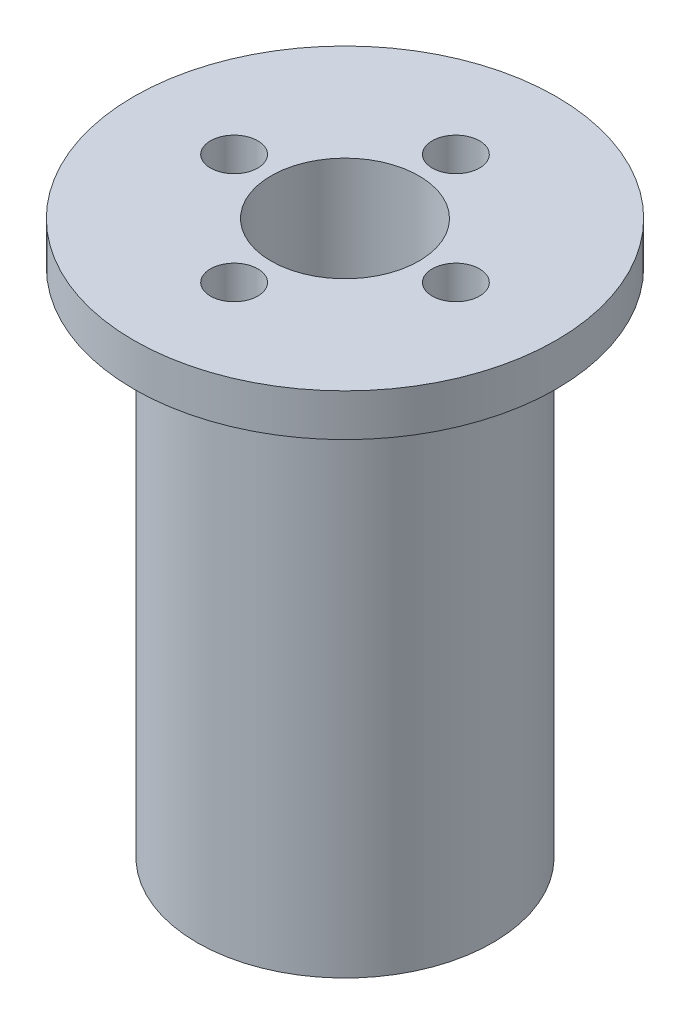
ISO-10303-21;
HEADER;
FILE_DESCRIPTION(('STEP AP214'),'2;1');
FILE_NAME('part.step','',(''),(''),'','','');
FILE_SCHEMA(('AUTOMOTIVE_DESIGN { 1 0 10303 214 1 1 1 1 }'));
ENDSEC;
DATA;
#1=APPLICATION_CONTEXT('core data for automotive mechanical design processes');
#2=APPLICATION_PROTOCOL_DEFINITION('international standard','automotive_design',2000,#1);
#3=PRODUCT_CONTEXT('',#1,'mechanical');
#4=PRODUCT('Part','Part','',(#3));
#5=PRODUCT_RELATED_PRODUCT_CATEGORY('part','',(#4));
#6=PRODUCT_DEFINITION_FORMATION('','',#4);
#7=PRODUCT_DEFINITION_CONTEXT('part definition',#1,'design');
#8=PRODUCT_DEFINITION('design','',#6,#7);
#9=PRODUCT_DEFINITION_SHAPE('','',#8);
#10=(LENGTH_UNIT() NAMED_UNIT(*) SI_UNIT(.MILLI.,.METRE.));
#11=(NAMED_UNIT(*) PLANE_ANGLE_UNIT() SI_UNIT($,.RADIAN.));
#12=(NAMED_UNIT(*) SI_UNIT($,.STERADIAN.) SOLID_ANGLE_UNIT());
#13=UNCERTAINTY_MEASURE_WITH_UNIT(LENGTH_MEASURE(1.E-05),#10,'distance_accuracy_value','');
#14=(GEOMETRIC_REPRESENTATION_CONTEXT(3) GLOBAL_UNCERTAINTY_ASSIGNED_CONTEXT((#13)) GLOBAL_UNIT_ASSIGNED_CONTEXT((#10,
#11,#12)) REPRESENTATION_CONTEXT('',''));
#15=CARTESIAN_POINT('',(0.,0.,0.));
#16=DIRECTION('',(0.,0.,1.));
#17=DIRECTION('',(1.,0.,0.));
#18=AXIS2_PLACEMENT_3D('',#15,#16,#17);
#19=CARTESIAN_POINT('',(0.,0.,0.));
#20=DIRECTION('',(0.,1.,0.));
#21=DIRECTION('',(0.,0.,1.));
#22=AXIS2_PLACEMENT_3D('',#19,#20,#21);
#23=CYLINDRICAL_SURFACE('',#22,25.);
#24=CARTESIAN_POINT('',(0.,0.,0.));
#25=DIRECTION('',(0.,1.,0.));
#26=DIRECTION('',(0.,0.,1.));
#27=AXIS2_PLACEMENT_3D('',#24,#25,#26);
#28=CIRCLE('',#27,25.);
#29=CARTESIAN_POINT('',(0.,0.,25.));
#30=VERTEX_POINT('',#29);
#31=EDGE_CURVE('E65',#30,#30,#28,.T.);
#32=ORIENTED_EDGE('',*,*,#31,.F.);
#33=EDGE_LOOP('',(#32));
#34=FACE_BOUND('',#33,.T.);
#35=CARTESIAN_POINT('',(0.,-4.99999999999998,0.));
#36=DIRECTION('',(0.,1.,0.));
#37=DIRECTION('',(0.,0.,1.));
#38=AXIS2_PLACEMENT_3D('',#35,#36,#37);
#39=CIRCLE('',#38,25.);
#40=CARTESIAN_POINT('',(0.,-4.99999999999998,25.));
#41=VERTEX_POINT('',#40);
#42=EDGE_CURVE('E10',#41,#41,#39,.T.);
#43=ORIENTED_EDGE('',*,*,#42,.T.);
#44=EDGE_LOOP('',(#43));
#45=FACE_BOUND('',#44,.T.);
#46=ADVANCED_FACE('F37',(#34,#45),#23,.T.);
#47=CARTESIAN_POINT('',(0.,-4.99999999999998,-25.));
#48=DIRECTION('',(0.,1.,0.));
#49=DIRECTION('',(0.,0.,1.));
#50=AXIS2_PLACEMENT_3D('',#47,#48,#49);
#51=PLANE('',#50);
#52=ORIENTED_EDGE('',*,*,#42,.F.);
#53=EDGE_LOOP('',(#52));
#54=FACE_BOUND('',#53,.T.);
#55=CARTESIAN_POINT('',(0.,-4.99999999999998,0.));
#56=DIRECTION('',(0.,1.,0.));
#57=DIRECTION('',(0.,0.,1.));
#58=AXIS2_PLACEMENT_3D('',#55,#56,#57);
#59=CIRCLE('',#58,19.5);
#60=CARTESIAN_POINT('',(0.,-4.99999999999998,19.5));
#61=VERTEX_POINT('',#60);
#62=EDGE_CURVE('E43',#61,#61,#59,.T.);
#63=ORIENTED_EDGE('',*,*,#62,.T.);
#64=EDGE_LOOP('',(#63));
#65=FACE_BOUND('',#64,.T.);
#66=ADVANCED_FACE('F156',(#54,#65),#51,.F.);
#67=CARTESIAN_POINT('',(0.,0.,0.));
#68=DIRECTION('',(0.,1.,0.));
#69=DIRECTION('',(0.,0.,1.));
#70=AXIS2_PLACEMENT_3D('',#67,#68,#69);
#71=CYLINDRICAL_SURFACE('',#70,19.5);
#72=ORIENTED_EDGE('',*,*,#62,.F.);
#73=EDGE_LOOP('',(#72));
#74=FACE_BOUND('',#73,.T.);
#75=CARTESIAN_POINT('',(0.,-5.99999999999998,0.));
#76=DIRECTION('',(0.,1.,0.));
#77=DIRECTION('',(0.,0.,1.));
#78=AXIS2_PLACEMENT_3D('',#75,#76,#77);
#79=CIRCLE('',#78,19.5);
#80=CARTESIAN_POINT('',(0.,-5.99999999999998,19.5));
#81=VERTEX_POINT('',#80);
#82=EDGE_CURVE('E47',#81,#81,#79,.T.);
#83=ORIENTED_EDGE('',*,*,#82,.T.);
#84=EDGE_LOOP('',(#83));
#85=FACE_BOUND('',#84,.T.);
#86=ADVANCED_FACE('F160',(#74,#85),#71,.T.);
#87=CARTESIAN_POINT('',(0.,-5.99999999999999,-19.5));
#88=DIRECTION('',(0.,1.,0.));
#89=DIRECTION('',(0.,0.,1.));
#90=AXIS2_PLACEMENT_3D('',#87,#88,#89);
#91=PLANE('',#90);
#92=ORIENTED_EDGE('',*,*,#82,.F.);
#93=EDGE_LOOP('',(#92));
#94=FACE_BOUND('',#93,.T.);
#95=CARTESIAN_POINT('',(0.,-5.99999999999999,0.));
#96=DIRECTION('',(0.,1.,0.));
#97=DIRECTION('',(0.,0.,1.));
#98=AXIS2_PLACEMENT_3D('',#95,#96,#97);
#99=CIRCLE('',#98,17.5);
#100=CARTESIAN_POINT('',(0.,-5.99999999999999,17.5));
#101=VERTEX_POINT('',#100);
#102=EDGE_CURVE('E51',#101,#101,#99,.T.);
#103=ORIENTED_EDGE('',*,*,#102,.T.);
#104=EDGE_LOOP('',(#103));
#105=FACE_BOUND('',#104,.T.);
#106=ADVANCED_FACE('F165',(#94,#105),#91,.F.);
#107=CARTESIAN_POINT('',(0.,0.,0.));
#108=DIRECTION('',(0.,1.,0.));
#109=DIRECTION('',(0.,0.,1.));
#110=AXIS2_PLACEMENT_3D('',#107,#108,#109);
#111=CYLINDRICAL_SURFACE('',#110,17.5);
#112=ORIENTED_EDGE('',*,*,#102,.F.);
#113=EDGE_LOOP('',(#112));
#114=FACE_BOUND('',#113,.T.);
#115=CARTESIAN_POINT('',(0.,-65.5,0.));
#116=DIRECTION('',(0.,1.,0.));
#117=DIRECTION('',(0.,0.,1.));
#118=AXIS2_PLACEMENT_3D('',#115,#116,#117);
#119=CIRCLE('',#118,17.5);
#120=CARTESIAN_POINT('',(0.,-65.5,17.5));
#121=VERTEX_POINT('',#120);
#122=EDGE_CURVE('E56',#121,#121,#119,.T.);
#123=ORIENTED_EDGE('',*,*,#122,.T.);
#124=EDGE_LOOP('',(#123));
#125=FACE_BOUND('',#124,.T.);
#126=ADVANCED_FACE('F130',(#114,#125),#111,.T.);
#127=CARTESIAN_POINT('',(0.,-65.5,-17.5));
#128=DIRECTION('',(0.,1.,0.));
#129=DIRECTION('',(0.,0.,1.));
#130=AXIS2_PLACEMENT_3D('',#127,#128,#129);
#131=PLANE('',#130);
#132=CARTESIAN_POINT('',(13.125,-65.5,0.));
#133=DIRECTION('',(0.,-1.,0.));
#134=DIRECTION('',(0.,0.,-1.));
#135=AXIS2_PLACEMENT_3D('',#132,#133,#134);
#136=CIRCLE('',#135,2.8);
#137=CARTESIAN_POINT('',(13.125,-65.5,-2.80000000000005));
#138=VERTEX_POINT('',#137);
#139=EDGE_CURVE('E111',#138,#138,#136,.T.);
#140=ORIENTED_EDGE('',*,*,#139,.F.);
#141=EDGE_LOOP('',(#140));
#142=FACE_BOUND('',#141,.T.);
#143=CARTESIAN_POINT('',(0.,-65.5,-13.125));
#144=DIRECTION('',(0.,-1.,0.));
#145=DIRECTION('',(0.,0.,-1.));
#146=AXIS2_PLACEMENT_3D('',#143,#144,#145);
#147=CIRCLE('',#146,2.8);
#148=CARTESIAN_POINT('',(0.,-65.5,-15.925));
#149=VERTEX_POINT('',#148);
#150=EDGE_CURVE('E105',#149,#149,#147,.T.);
#151=ORIENTED_EDGE('',*,*,#150,.F.);
#152=EDGE_LOOP('',(#151));
#153=FACE_BOUND('',#152,.T.);
#154=CARTESIAN_POINT('',(-13.125,-65.5,1.37477077716948E-13));
#155=DIRECTION('',(0.,-1.,0.));
#156=DIRECTION('',(0.,0.,-1.));
#157=AXIS2_PLACEMENT_3D('',#154,#155,#156);
#158=CIRCLE('',#157,2.8);
#159=CARTESIAN_POINT('',(-13.125,-65.5,-2.79999999999986));
#160=VERTEX_POINT('',#159);
#161=EDGE_CURVE('E99',#160,#160,#158,.T.);
#162=ORIENTED_EDGE('',*,*,#161,.F.);
#163=EDGE_LOOP('',(#162));
#164=FACE_BOUND('',#163,.T.);
#165=CARTESIAN_POINT('',(0.,-65.5,13.125));
#166=DIRECTION('',(0.,-1.,0.));
#167=DIRECTION('',(0.,0.,-1.));
#168=AXIS2_PLACEMENT_3D('',#165,#166,#167);
#169=CIRCLE('',#168,2.8);
#170=CARTESIAN_POINT('',(0.,-65.5,10.325));
#171=VERTEX_POINT('',#170);
#172=EDGE_CURVE('E93',#171,#171,#169,.T.);
#173=ORIENTED_EDGE('',*,*,#172,.F.);
#174=EDGE_LOOP('',(#173));
#175=FACE_BOUND('',#174,.T.);
#176=ORIENTED_EDGE('',*,*,#122,.F.);
#177=EDGE_LOOP('',(#176));
#178=FACE_BOUND('',#177,.T.);
#179=CARTESIAN_POINT('',(0.,-65.5,0.));
#180=DIRECTION('',(0.,1.,0.));
#181=DIRECTION('',(0.,0.,1.));
#182=AXIS2_PLACEMENT_3D('',#179,#180,#181);
#183=CIRCLE('',#182,8.75);
#184=CARTESIAN_POINT('',(0.,-65.5,8.75));
#185=VERTEX_POINT('',#184);
#186=EDGE_CURVE('E59',#185,#185,#183,.T.);
#187=ORIENTED_EDGE('',*,*,#186,.T.);
#188=EDGE_LOOP('',(#187));
#189=FACE_BOUND('',#188,.T.);
#190=ADVANCED_FACE('F126',(#142,#153,#164,#175,#178,#189),#131,.F.);
#191=CARTESIAN_POINT('',(0.,0.,0.));
#192=DIRECTION('',(0.,1.,0.));
#193=DIRECTION('',(0.,0.,1.));
#194=AXIS2_PLACEMENT_3D('',#191,#192,#193);
#195=CYLINDRICAL_SURFACE('',#194,8.75);
#196=ORIENTED_EDGE('',*,*,#186,.F.);
#197=EDGE_LOOP('',(#196));
#198=FACE_BOUND('',#197,.T.);
#199=CARTESIAN_POINT('',(0.,0.,0.));
#200=DIRECTION('',(0.,1.,0.));
#201=DIRECTION('',(0.,0.,1.));
#202=AXIS2_PLACEMENT_3D('',#199,#200,#201);
#203=CIRCLE('',#202,8.75);
#204=CARTESIAN_POINT('',(0.,0.,8.75));
#205=VERTEX_POINT('',#204);
#206=EDGE_CURVE('E62',#205,#205,#203,.T.);
#207=ORIENTED_EDGE('',*,*,#206,.T.);
#208=EDGE_LOOP('',(#207));
#209=FACE_BOUND('',#208,.T.);
#210=ADVANCED_FACE('F129',(#198,#209),#195,.F.);
#211=CARTESIAN_POINT('',(0.,0.,-8.75));
#212=DIRECTION('',(0.,-1.,0.));
#213=DIRECTION('',(0.,0.,-1.));
#214=AXIS2_PLACEMENT_3D('',#211,#212,#213);
#215=PLANE('',#214);
#216=CARTESIAN_POINT('',(0.,0.,-13.125));
#217=DIRECTION('',(0.,1.,0.));
#218=DIRECTION('',(0.,0.,1.));
#219=AXIS2_PLACEMENT_3D('',#216,#217,#218);
#220=CIRCLE('',#219,2.8);
#221=CARTESIAN_POINT('',(0.,0.,-10.325));
#222=VERTEX_POINT('',#221);
#223=EDGE_CURVE('E88',#222,#222,#220,.T.);
#224=ORIENTED_EDGE('',*,*,#223,.F.);
#225=EDGE_LOOP('',(#224));
#226=FACE_BOUND('',#225,.T.);
#227=CARTESIAN_POINT('',(13.125,0.,0.));
#228=DIRECTION('',(0.,1.,0.));
#229=DIRECTION('',(0.,0.,1.));
#230=AXIS2_PLACEMENT_3D('',#227,#228,#229);
#231=CIRCLE('',#230,2.8);
#232=CARTESIAN_POINT('',(13.125,0.,2.80000000000004));
#233=VERTEX_POINT('',#232);
#234=EDGE_CURVE('E85',#233,#233,#231,.T.);
#235=ORIENTED_EDGE('',*,*,#234,.F.);
#236=EDGE_LOOP('',(#235));
#237=FACE_BOUND('',#236,.T.);
#238=CARTESIAN_POINT('',(-13.125,0.,-1.37477077716948E-13));
#239=DIRECTION('',(0.,1.,0.));
#240=DIRECTION('',(0.,0.,1.));
#241=AXIS2_PLACEMENT_3D('',#238,#239,#240);
#242=CIRCLE('',#241,2.8);
#243=CARTESIAN_POINT('',(-13.125,0.,2.79999999999986));
#244=VERTEX_POINT('',#243);
#245=EDGE_CURVE('E79',#244,#244,#242,.T.);
#246=ORIENTED_EDGE('',*,*,#245,.F.);
#247=EDGE_LOOP('',(#246));
#248=FACE_BOUND('',#247,.T.);
#249=CARTESIAN_POINT('',(0.,0.,13.125));
#250=DIRECTION('',(0.,1.,0.));
#251=DIRECTION('',(0.,0.,1.));
#252=AXIS2_PLACEMENT_3D('',#249,#250,#251);
#253=CIRCLE('',#252,2.8);
#254=CARTESIAN_POINT('',(0.,0.,15.925));
#255=VERTEX_POINT('',#254);
#256=EDGE_CURVE('E72',#255,#255,#253,.T.);
#257=ORIENTED_EDGE('',*,*,#256,.F.);
#258=EDGE_LOOP('',(#257));
#259=FACE_BOUND('',#258,.T.);
#260=ORIENTED_EDGE('',*,*,#206,.F.);
#261=EDGE_LOOP('',(#260));
#262=FACE_BOUND('',#261,.T.);
#263=ORIENTED_EDGE('',*,*,#31,.T.);
#264=EDGE_LOOP('',(#263));
#265=FACE_BOUND('',#264,.T.);
#266=ADVANCED_FACE('F144',(#226,#237,#248,#259,#262,#265),#215,.F.);
#267=CARTESIAN_POINT('',(0.,-15.,13.125));
#268=DIRECTION('',(0.,1.,0.));
#269=DIRECTION('',(0.,0.,1.));
#270=AXIS2_PLACEMENT_3D('',#267,#268,#269);
#271=CYLINDRICAL_SURFACE('',#270,2.8);
#272=CARTESIAN_POINT('',(0.,-15.,13.125));
#273=DIRECTION('',(0.,1.,0.));
#274=DIRECTION('',(0.,0.,1.));
#275=AXIS2_PLACEMENT_3D('',#272,#273,#274);
#276=CIRCLE('',#275,2.8);
#277=CARTESIAN_POINT('',(0.,-15.,15.925));
#278=VERTEX_POINT('',#277);
#279=EDGE_CURVE('E69',#278,#278,#276,.T.);
#280=ORIENTED_EDGE('',*,*,#279,.F.);
#281=EDGE_LOOP('',(#280));
#282=FACE_BOUND('',#281,.T.);
#283=ORIENTED_EDGE('',*,*,#256,.T.);
#284=EDGE_LOOP('',(#283));
#285=FACE_BOUND('',#284,.T.);
#286=ADVANCED_FACE('F150',(#282,#285),#271,.F.);
#287=CARTESIAN_POINT('',(0.,-15.,13.125));
#288=DIRECTION('',(0.,1.,0.));
#289=DIRECTION('',(0.,0.,1.));
#290=AXIS2_PLACEMENT_3D('',#287,#288,#289);
#291=PLANE('',#290);
#292=ORIENTED_EDGE('',*,*,#279,.T.);
#293=EDGE_LOOP('',(#292));
#294=FACE_BOUND('',#293,.T.);
#295=ADVANCED_FACE('F175',(#294),#291,.T.);
#296=CARTESIAN_POINT('',(-13.125,-15.,-1.37477077716948E-13));
#297=DIRECTION('',(0.,1.,0.));
#298=DIRECTION('',(0.,0.,1.));
#299=AXIS2_PLACEMENT_3D('',#296,#297,#298);
#300=CYLINDRICAL_SURFACE('',#299,2.8);
#301=CARTESIAN_POINT('',(-13.125,-15.,-1.37477077716948E-13));
#302=DIRECTION('',(0.,1.,0.));
#303=DIRECTION('',(0.,0.,1.));
#304=AXIS2_PLACEMENT_3D('',#301,#302,#303);
#305=CIRCLE('',#304,2.8);
#306=CARTESIAN_POINT('',(-13.125,-15.,2.79999999999986));
#307=VERTEX_POINT('',#306);
#308=EDGE_CURVE('E76',#307,#307,#305,.T.);
#309=ORIENTED_EDGE('',*,*,#308,.F.);
#310=EDGE_LOOP('',(#309));
#311=FACE_BOUND('',#310,.T.);
#312=ORIENTED_EDGE('',*,*,#245,.T.);
#313=EDGE_LOOP('',(#312));
#314=FACE_BOUND('',#313,.T.);
#315=ADVANCED_FACE('F178',(#311,#314),#300,.F.);
#316=CARTESIAN_POINT('',(-13.125,-15.,-1.37477077716948E-13));
#317=DIRECTION('',(0.,1.,0.));
#318=DIRECTION('',(0.,0.,1.));
#319=AXIS2_PLACEMENT_3D('',#316,#317,#318);
#320=PLANE('',#319);
#321=ORIENTED_EDGE('',*,*,#308,.T.);
#322=EDGE_LOOP('',(#321));
#323=FACE_BOUND('',#322,.T.);
#324=ADVANCED_FACE('F183',(#323),#320,.T.);
#325=CARTESIAN_POINT('',(13.125,-15.,0.));
#326=DIRECTION('',(0.,1.,0.));
#327=DIRECTION('',(0.,0.,1.));
#328=AXIS2_PLACEMENT_3D('',#325,#326,#327);
#329=CYLINDRICAL_SURFACE('',#328,2.8);
#330=CARTESIAN_POINT('',(13.125,-15.,0.));
#331=DIRECTION('',(0.,1.,0.));
#332=DIRECTION('',(0.,0.,1.));
#333=AXIS2_PLACEMENT_3D('',#330,#331,#332);
#334=CIRCLE('',#333,2.8);
#335=CARTESIAN_POINT('',(13.125,-15.,2.80000000000004));
#336=VERTEX_POINT('',#335);
#337=EDGE_CURVE('E82',#336,#336,#334,.T.);
#338=ORIENTED_EDGE('',*,*,#337,.F.);
#339=EDGE_LOOP('',(#338));
#340=FACE_BOUND('',#339,.T.);
#341=ORIENTED_EDGE('',*,*,#234,.T.);
#342=EDGE_LOOP('',(#341));
#343=FACE_BOUND('',#342,.T.);
#344=ADVANCED_FACE('F186',(#340,#343),#329,.F.);
#345=CARTESIAN_POINT('',(13.125,-15.,0.));
#346=DIRECTION('',(0.,1.,0.));
#347=DIRECTION('',(0.,0.,1.));
#348=AXIS2_PLACEMENT_3D('',#345,#346,#347);
#349=PLANE('',#348);
#350=ORIENTED_EDGE('',*,*,#337,.T.);
#351=EDGE_LOOP('',(#350));
#352=FACE_BOUND('',#351,.T.);
#353=ADVANCED_FACE('F191',(#352),#349,.T.);
#354=CARTESIAN_POINT('',(0.,-15.,-13.125));
#355=DIRECTION('',(0.,1.,0.));
#356=DIRECTION('',(0.,0.,1.));
#357=AXIS2_PLACEMENT_3D('',#354,#355,#356);
#358=CYLINDRICAL_SURFACE('',#357,2.8);
#359=CARTESIAN_POINT('',(0.,-15.,-13.125));
#360=DIRECTION('',(0.,1.,0.));
#361=DIRECTION('',(0.,0.,1.));
#362=AXIS2_PLACEMENT_3D('',#359,#360,#361);
#363=CIRCLE('',#362,2.8);
#364=CARTESIAN_POINT('',(0.,-15.,-10.325));
#365=VERTEX_POINT('',#364);
#366=EDGE_CURVE('E68',#365,#365,#363,.T.);
#367=ORIENTED_EDGE('',*,*,#366,.F.);
#368=EDGE_LOOP('',(#367));
#369=FACE_BOUND('',#368,.T.);
#370=ORIENTED_EDGE('',*,*,#223,.T.);
#371=EDGE_LOOP('',(#370));
#372=FACE_BOUND('',#371,.T.);
#373=ADVANCED_FACE('F194',(#369,#372),#358,.F.);
#374=CARTESIAN_POINT('',(0.,-15.,-13.125));
#375=DIRECTION('',(0.,1.,0.));
#376=DIRECTION('',(0.,0.,1.));
#377=AXIS2_PLACEMENT_3D('',#374,#375,#376);
#378=PLANE('',#377);
#379=ORIENTED_EDGE('',*,*,#366,.T.);
#380=EDGE_LOOP('',(#379));
#381=FACE_BOUND('',#380,.T.);
#382=ADVANCED_FACE('F201',(#381),#378,.T.);
#383=CARTESIAN_POINT('',(0.,-50.5,13.125));
#384=DIRECTION('',(0.,-1.,0.));
#385=DIRECTION('',(0.,0.,-1.));
#386=AXIS2_PLACEMENT_3D('',#383,#384,#385);
#387=CYLINDRICAL_SURFACE('',#386,2.8);
#388=CARTESIAN_POINT('',(0.,-50.5,13.125));
#389=DIRECTION('',(0.,-1.,0.));
#390=DIRECTION('',(0.,0.,-1.));
#391=AXIS2_PLACEMENT_3D('',#388,#389,#390);
#392=CIRCLE('',#391,2.8);
#393=CARTESIAN_POINT('',(0.,-50.5,10.325));
#394=VERTEX_POINT('',#393);
#395=EDGE_CURVE('E96',#394,#394,#392,.T.);
#396=ORIENTED_EDGE('',*,*,#395,.F.);
#397=EDGE_LOOP('',(#396));
#398=FACE_BOUND('',#397,.T.);
#399=ORIENTED_EDGE('',*,*,#172,.T.);
#400=EDGE_LOOP('',(#399));
#401=FACE_BOUND('',#400,.T.);
#402=ADVANCED_FACE('F205',(#398,#401),#387,.F.);
#403=CARTESIAN_POINT('',(0.,-50.5,0.));
#404=DIRECTION('',(0.,-1.,0.));
#405=DIRECTION('',(0.,0.,-1.));
#406=AXIS2_PLACEMENT_3D('',#403,#404,#405);
#407=PLANE('',#406);
#408=ORIENTED_EDGE('',*,*,#395,.T.);
#409=EDGE_LOOP('',(#408));
#410=FACE_BOUND('',#409,.T.);
#411=ADVANCED_FACE('F209',(#410),#407,.T.);
#412=CARTESIAN_POINT('',(-13.125,-50.5,1.37477077716948E-13));
#413=DIRECTION('',(0.,-1.,0.));
#414=DIRECTION('',(0.,0.,-1.));
#415=AXIS2_PLACEMENT_3D('',#412,#413,#414);
#416=CYLINDRICAL_SURFACE('',#415,2.8);
#417=CARTESIAN_POINT('',(-13.125,-50.5,1.37477077716948E-13));
#418=DIRECTION('',(0.,-1.,0.));
#419=DIRECTION('',(0.,0.,-1.));
#420=AXIS2_PLACEMENT_3D('',#417,#418,#419);
#421=CIRCLE('',#420,2.8);
#422=CARTESIAN_POINT('',(-13.125,-50.5,-2.79999999999986));
#423=VERTEX_POINT('',#422);
#424=EDGE_CURVE('E102',#423,#423,#421,.T.);
#425=ORIENTED_EDGE('',*,*,#424,.F.);
#426=EDGE_LOOP('',(#425));
#427=FACE_BOUND('',#426,.T.);
#428=ORIENTED_EDGE('',*,*,#161,.T.);
#429=EDGE_LOOP('',(#428));
#430=FACE_BOUND('',#429,.T.);
#431=ADVANCED_FACE('F213',(#427,#430),#416,.F.);
#432=CARTESIAN_POINT('',(0.,-50.5,0.));
#433=DIRECTION('',(0.,-1.,0.));
#434=DIRECTION('',(0.,0.,-1.));
#435=AXIS2_PLACEMENT_3D('',#432,#433,#434);
#436=PLANE('',#435);
#437=ORIENTED_EDGE('',*,*,#424,.T.);
#438=EDGE_LOOP('',(#437));
#439=FACE_BOUND('',#438,.T.);
#440=ADVANCED_FACE('F217',(#439),#436,.T.);
#441=CARTESIAN_POINT('',(0.,-50.5,-13.125));
#442=DIRECTION('',(0.,-1.,0.));
#443=DIRECTION('',(0.,0.,-1.));
#444=AXIS2_PLACEMENT_3D('',#441,#442,#443);
#445=CYLINDRICAL_SURFACE('',#444,2.8);
#446=CARTESIAN_POINT('',(0.,-50.5,-13.125));
#447=DIRECTION('',(0.,-1.,0.));
#448=DIRECTION('',(0.,0.,-1.));
#449=AXIS2_PLACEMENT_3D('',#446,#447,#448);
#450=CIRCLE('',#449,2.8);
#451=CARTESIAN_POINT('',(0.,-50.5,-15.925));
#452=VERTEX_POINT('',#451);
#453=EDGE_CURVE('E108',#452,#452,#450,.T.);
#454=ORIENTED_EDGE('',*,*,#453,.F.);
#455=EDGE_LOOP('',(#454));
#456=FACE_BOUND('',#455,.T.);
#457=ORIENTED_EDGE('',*,*,#150,.T.);
#458=EDGE_LOOP('',(#457));
#459=FACE_BOUND('',#458,.T.);
#460=ADVANCED_FACE('F221',(#456,#459),#445,.F.);
#461=CARTESIAN_POINT('',(0.,-50.5,0.));
#462=DIRECTION('',(0.,-1.,0.));
#463=DIRECTION('',(0.,0.,-1.));
#464=AXIS2_PLACEMENT_3D('',#461,#462,#463);
#465=PLANE('',#464);
#466=ORIENTED_EDGE('',*,*,#453,.T.);
#467=EDGE_LOOP('',(#466));
#468=FACE_BOUND('',#467,.T.);
#469=ADVANCED_FACE('F122',(#468),#465,.T.);
#470=CARTESIAN_POINT('',(13.125,-50.5,0.));
#471=DIRECTION('',(0.,-1.,0.));
#472=DIRECTION('',(0.,0.,-1.));
#473=AXIS2_PLACEMENT_3D('',#470,#471,#472);
#474=CYLINDRICAL_SURFACE('',#473,2.8);
#475=CARTESIAN_POINT('',(13.125,-50.5,0.));
#476=DIRECTION('',(0.,-1.,0.));
#477=DIRECTION('',(0.,0.,-1.));
#478=AXIS2_PLACEMENT_3D('',#475,#476,#477);
#479=CIRCLE('',#478,2.8);
#480=CARTESIAN_POINT('',(13.125,-50.5,-2.80000000000005));
#481=VERTEX_POINT('',#480);
#482=EDGE_CURVE('E73',#481,#481,#479,.T.);
#483=ORIENTED_EDGE('',*,*,#482,.F.);
#484=EDGE_LOOP('',(#483));
#485=FACE_BOUND('',#484,.T.);
#486=ORIENTED_EDGE('',*,*,#139,.T.);
#487=EDGE_LOOP('',(#486));
#488=FACE_BOUND('',#487,.T.);
#489=ADVANCED_FACE('F119',(#485,#488),#474,.F.);
#490=CARTESIAN_POINT('',(0.,-50.5,0.));
#491=DIRECTION('',(0.,-1.,0.));
#492=DIRECTION('',(0.,0.,-1.));
#493=AXIS2_PLACEMENT_3D('',#490,#491,#492);
#494=PLANE('',#493);
#495=ORIENTED_EDGE('',*,*,#482,.T.);
#496=EDGE_LOOP('',(#495));
#497=FACE_BOUND('',#496,.T.);
#498=ADVANCED_FACE('F117',(#497),#494,.T.);
#499=CLOSED_SHELL('',(#46,#66,#86,#106,#126,#190,#210,#266,#286,#295,#315,#324,#344,#353,#373,
#382,#402,#411,#431,#440,#460,#469,#489,#498));
#500=MANIFOLD_SOLID_BREP('B2',#499);
#501=ADVANCED_BREP_SHAPE_REPRESENTATION('',(#18,#500),#14);
#502=SHAPE_DEFINITION_REPRESENTATION(#9,#501);
ENDSEC;
END-ISO-10303-21;
